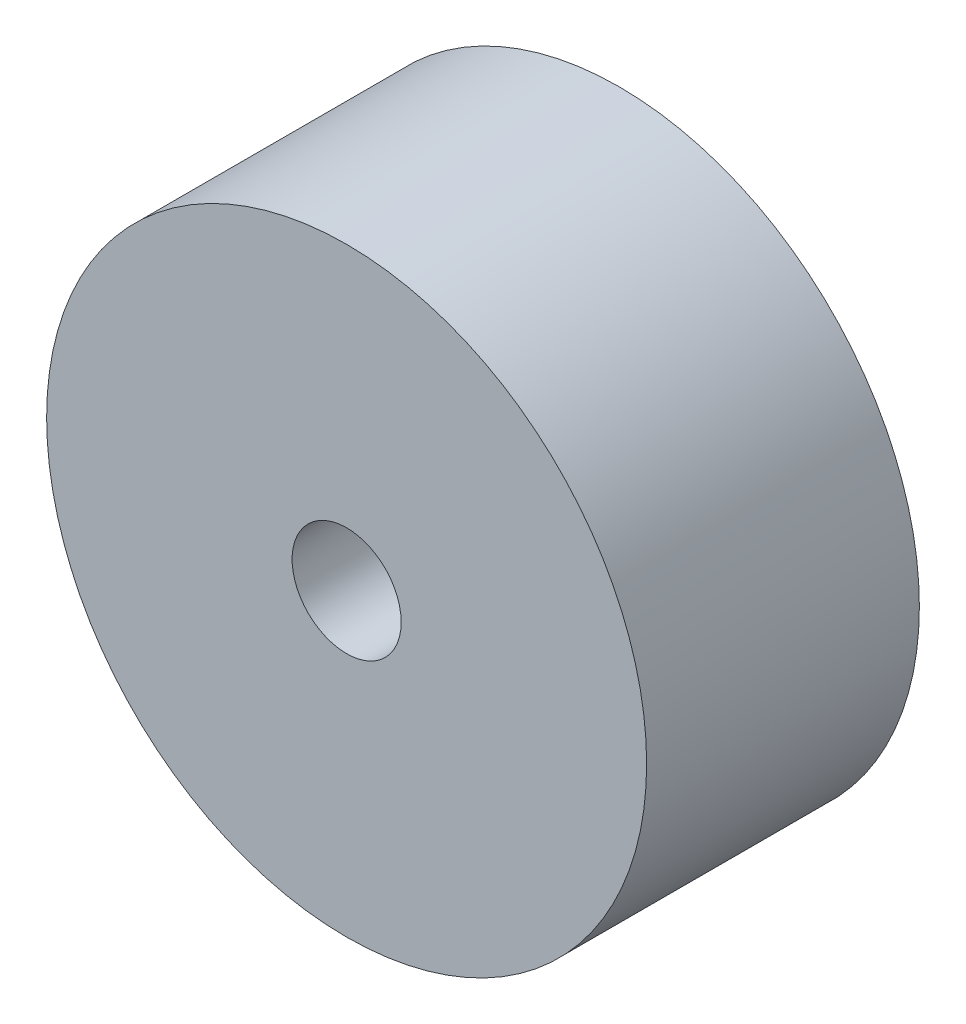
ISO-10303-21;
HEADER;
FILE_DESCRIPTION(('STEP AP214'),'2;1');
FILE_NAME('part.step','',(''),(''),'','','');
FILE_SCHEMA(('AUTOMOTIVE_DESIGN { 1 0 10303 214 1 1 1 1 }'));
ENDSEC;
DATA;
#1=APPLICATION_CONTEXT('core data for automotive mechanical design processes');
#2=APPLICATION_PROTOCOL_DEFINITION('international standard','automotive_design',2000,#1);
#3=PRODUCT_CONTEXT('',#1,'mechanical');
#4=PRODUCT('Part','Part','',(#3));
#5=PRODUCT_RELATED_PRODUCT_CATEGORY('part','',(#4));
#6=PRODUCT_DEFINITION_FORMATION('','',#4);
#7=PRODUCT_DEFINITION_CONTEXT('part definition',#1,'design');
#8=PRODUCT_DEFINITION('design','',#6,#7);
#9=PRODUCT_DEFINITION_SHAPE('','',#8);
#10=(LENGTH_UNIT() NAMED_UNIT(*) SI_UNIT(.MILLI.,.METRE.));
#11=(NAMED_UNIT(*) PLANE_ANGLE_UNIT() SI_UNIT($,.RADIAN.));
#12=(NAMED_UNIT(*) SI_UNIT($,.STERADIAN.) SOLID_ANGLE_UNIT());
#13=UNCERTAINTY_MEASURE_WITH_UNIT(LENGTH_MEASURE(1.E-05),#10,'distance_accuracy_value','');
#14=(GEOMETRIC_REPRESENTATION_CONTEXT(3) GLOBAL_UNCERTAINTY_ASSIGNED_CONTEXT((#13)) GLOBAL_UNIT_ASSIGNED_CONTEXT((#10,
#11,#12)) REPRESENTATION_CONTEXT('',''));
#15=CARTESIAN_POINT('',(0.,0.,0.));
#16=DIRECTION('',(0.,0.,1.));
#17=DIRECTION('',(1.,0.,0.));
#18=AXIS2_PLACEMENT_3D('',#15,#16,#17);
#19=CARTESIAN_POINT('',(0.,0.,25.));
#20=DIRECTION('',(0.,0.,-1.));
#21=DIRECTION('',(-1.,0.,0.));
#22=AXIS2_PLACEMENT_3D('',#19,#20,#21);
#23=CYLINDRICAL_SURFACE('',#22,27.5);
#24=CARTESIAN_POINT('',(0.,0.,25.));
#25=DIRECTION('',(0.,0.,1.));
#26=DIRECTION('',(1.,0.,0.));
#27=AXIS2_PLACEMENT_3D('',#24,#25,#26);
#28=CIRCLE('',#27,27.5);
#29=CARTESIAN_POINT('',(27.5,0.,25.));
#30=VERTEX_POINT('',#29);
#31=EDGE_CURVE('E10',#30,#30,#28,.T.);
#32=ORIENTED_EDGE('',*,*,#31,.F.);
#33=EDGE_LOOP('',(#32));
#34=FACE_BOUND('',#33,.T.);
#35=CARTESIAN_POINT('',(0.,0.,0.));
#36=DIRECTION('',(0.,0.,1.));
#37=DIRECTION('',(1.,0.,0.));
#38=AXIS2_PLACEMENT_3D('',#35,#36,#37);
#39=CIRCLE('',#38,27.5);
#40=CARTESIAN_POINT('',(27.5,0.,0.));
#41=VERTEX_POINT('',#40);
#42=EDGE_CURVE('E42',#41,#41,#39,.T.);
#43=ORIENTED_EDGE('',*,*,#42,.T.);
#44=EDGE_LOOP('',(#43));
#45=FACE_BOUND('',#44,.T.);
#46=ADVANCED_FACE('F39',(#34,#45),#23,.T.);
#47=CARTESIAN_POINT('',(0.,0.,25.));
#48=DIRECTION('',(0.,0.,1.));
#49=DIRECTION('',(1.,0.,0.));
#50=AXIS2_PLACEMENT_3D('',#47,#48,#49);
#51=PLANE('',#50);
#52=CARTESIAN_POINT('',(0.,0.,25.));
#53=DIRECTION('',(0.,0.,1.));
#54=DIRECTION('',(1.,0.,0.));
#55=AXIS2_PLACEMENT_3D('',#52,#53,#54);
#56=CIRCLE('',#55,5.);
#57=CARTESIAN_POINT('',(5.,0.,25.));
#58=VERTEX_POINT('',#57);
#59=EDGE_CURVE('E51',#58,#58,#56,.T.);
#60=ORIENTED_EDGE('',*,*,#59,.F.);
#61=EDGE_LOOP('',(#60));
#62=FACE_BOUND('',#61,.T.);
#63=ORIENTED_EDGE('',*,*,#31,.T.);
#64=EDGE_LOOP('',(#63));
#65=FACE_BOUND('',#64,.T.);
#66=ADVANCED_FACE('F66',(#62,#65),#51,.T.);
#67=CARTESIAN_POINT('',(0.,0.,0.));
#68=DIRECTION('',(0.,0.,1.));
#69=DIRECTION('',(1.,0.,0.));
#70=AXIS2_PLACEMENT_3D('',#67,#68,#69);
#71=PLANE('',#70);
#72=CARTESIAN_POINT('',(0.,0.,0.));
#73=DIRECTION('',(0.,0.,1.));
#74=DIRECTION('',(1.,0.,0.));
#75=AXIS2_PLACEMENT_3D('',#72,#73,#74);
#76=CIRCLE('',#75,5.);
#77=CARTESIAN_POINT('',(5.,0.,0.));
#78=VERTEX_POINT('',#77);
#79=EDGE_CURVE('E49',#78,#78,#76,.T.);
#80=ORIENTED_EDGE('',*,*,#79,.T.);
#81=EDGE_LOOP('',(#80));
#82=FACE_BOUND('',#81,.T.);
#83=ORIENTED_EDGE('',*,*,#42,.F.);
#84=EDGE_LOOP('',(#83));
#85=FACE_BOUND('',#84,.T.);
#86=ADVANCED_FACE('F57',(#82,#85),#71,.F.);
#87=CARTESIAN_POINT('',(0.,0.,0.));
#88=DIRECTION('',(0.,0.,1.));
#89=DIRECTION('',(1.,0.,0.));
#90=AXIS2_PLACEMENT_3D('',#87,#88,#89);
#91=CYLINDRICAL_SURFACE('',#90,5.);
#92=ORIENTED_EDGE('',*,*,#79,.F.);
#93=EDGE_LOOP('',(#92));
#94=FACE_BOUND('',#93,.T.);
#95=ORIENTED_EDGE('',*,*,#59,.T.);
#96=EDGE_LOOP('',(#95));
#97=FACE_BOUND('',#96,.T.);
#98=ADVANCED_FACE('F60',(#94,#97),#91,.F.);
#99=CLOSED_SHELL('',(#46,#66,#86,#98));
#100=MANIFOLD_SOLID_BREP('B2',#99);
#101=ADVANCED_BREP_SHAPE_REPRESENTATION('',(#18,#100),#14);
#102=SHAPE_DEFINITION_REPRESENTATION(#9,#101);
ENDSEC;
END-ISO-10303-21;
